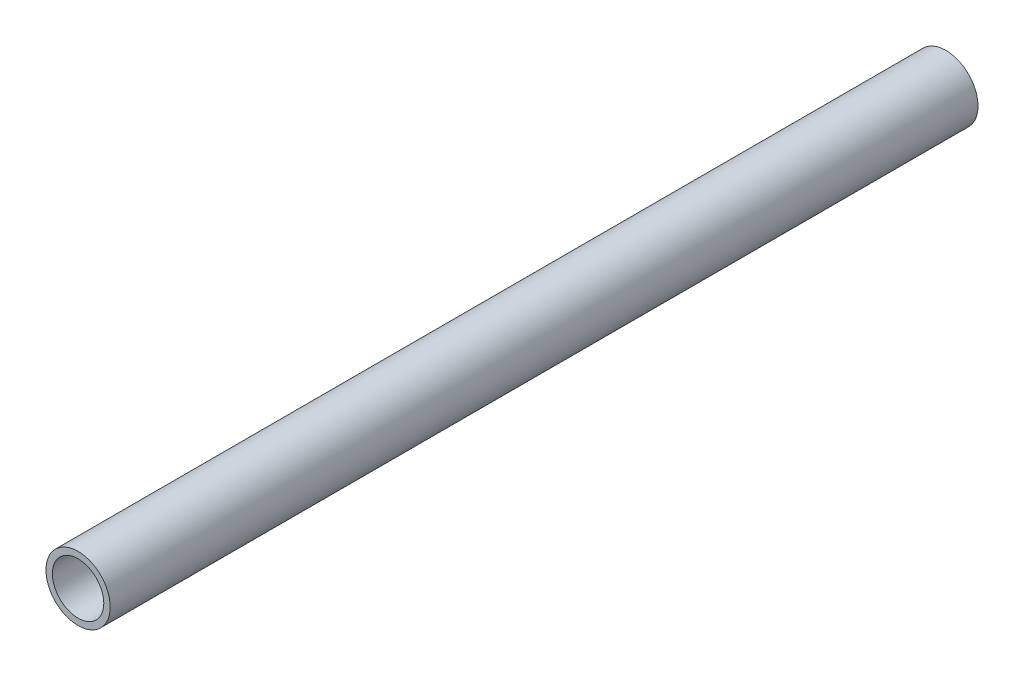
ISO-10303-21;
HEADER;
FILE_DESCRIPTION(('STEP AP214'),'2;1');
FILE_NAME('part.step','',(''),(''),'','','');
FILE_SCHEMA(('AUTOMOTIVE_DESIGN { 1 0 10303 214 1 1 1 1 }'));
ENDSEC;
DATA;
#1=APPLICATION_CONTEXT('core data for automotive mechanical design processes');
#2=APPLICATION_PROTOCOL_DEFINITION('international standard','automotive_design',2000,#1);
#3=PRODUCT_CONTEXT('',#1,'mechanical');
#4=PRODUCT('Part','Part','',(#3));
#5=PRODUCT_RELATED_PRODUCT_CATEGORY('part','',(#4));
#6=PRODUCT_DEFINITION_FORMATION('','',#4);
#7=PRODUCT_DEFINITION_CONTEXT('part definition',#1,'design');
#8=PRODUCT_DEFINITION('design','',#6,#7);
#9=PRODUCT_DEFINITION_SHAPE('','',#8);
#10=(LENGTH_UNIT() NAMED_UNIT(*) SI_UNIT(.MILLI.,.METRE.));
#11=(NAMED_UNIT(*) PLANE_ANGLE_UNIT() SI_UNIT($,.RADIAN.));
#12=(NAMED_UNIT(*) SI_UNIT($,.STERADIAN.) SOLID_ANGLE_UNIT());
#13=UNCERTAINTY_MEASURE_WITH_UNIT(LENGTH_MEASURE(1.E-05),#10,'distance_accuracy_value','');
#14=(GEOMETRIC_REPRESENTATION_CONTEXT(3) GLOBAL_UNCERTAINTY_ASSIGNED_CONTEXT((#13)) GLOBAL_UNIT_ASSIGNED_CONTEXT((#10,
#11,#12)) REPRESENTATION_CONTEXT('',''));
#15=CARTESIAN_POINT('',(0.,0.,0.));
#16=DIRECTION('',(0.,0.,1.));
#17=DIRECTION('',(1.,0.,0.));
#18=AXIS2_PLACEMENT_3D('',#15,#16,#17);
#19=CARTESIAN_POINT('',(0.,0.,270.));
#20=DIRECTION('',(0.,0.,1.));
#21=DIRECTION('',(1.,0.,0.));
#22=AXIS2_PLACEMENT_3D('',#19,#20,#21);
#23=PLANE('',#22);
#24=CARTESIAN_POINT('',(0.,0.,270.));
#25=DIRECTION('',(0.,0.,1.));
#26=DIRECTION('',(1.,0.,0.));
#27=AXIS2_PLACEMENT_3D('',#24,#25,#26);
#28=CIRCLE('',#27,10.);
#29=CARTESIAN_POINT('',(10.,0.,270.));
#30=VERTEX_POINT('',#29);
#31=EDGE_CURVE('E11',#30,#30,#28,.T.);
#32=ORIENTED_EDGE('',*,*,#31,.T.);
#33=EDGE_LOOP('',(#32));
#34=FACE_BOUND('',#33,.T.);
#35=CARTESIAN_POINT('',(0.,0.,270.));
#36=DIRECTION('',(0.,0.,1.));
#37=DIRECTION('',(1.,0.,0.));
#38=AXIS2_PLACEMENT_3D('',#35,#36,#37);
#39=CIRCLE('',#38,8.);
#40=CARTESIAN_POINT('',(8.,0.,270.));
#41=VERTEX_POINT('',#40);
#42=EDGE_CURVE('E48',#41,#41,#39,.T.);
#43=ORIENTED_EDGE('',*,*,#42,.F.);
#44=EDGE_LOOP('',(#43));
#45=FACE_BOUND('',#44,.T.);
#46=ADVANCED_FACE('F37',(#34,#45),#23,.T.);
#47=CARTESIAN_POINT('',(0.,0.,0.));
#48=DIRECTION('',(0.,0.,1.));
#49=DIRECTION('',(1.,0.,0.));
#50=AXIS2_PLACEMENT_3D('',#47,#48,#49);
#51=PLANE('',#50);
#52=CARTESIAN_POINT('',(0.,0.,0.));
#53=DIRECTION('',(0.,0.,1.));
#54=DIRECTION('',(1.,0.,0.));
#55=AXIS2_PLACEMENT_3D('',#52,#53,#54);
#56=CIRCLE('',#55,10.);
#57=CARTESIAN_POINT('',(10.,0.,0.));
#58=VERTEX_POINT('',#57);
#59=EDGE_CURVE('E41',#58,#58,#56,.T.);
#60=ORIENTED_EDGE('',*,*,#59,.F.);
#61=EDGE_LOOP('',(#60));
#62=FACE_BOUND('',#61,.T.);
#63=CARTESIAN_POINT('',(0.,0.,0.));
#64=DIRECTION('',(0.,0.,1.));
#65=DIRECTION('',(1.,0.,0.));
#66=AXIS2_PLACEMENT_3D('',#63,#64,#65);
#67=CIRCLE('',#66,8.);
#68=CARTESIAN_POINT('',(8.,0.,0.));
#69=VERTEX_POINT('',#68);
#70=EDGE_CURVE('E50',#69,#69,#67,.T.);
#71=ORIENTED_EDGE('',*,*,#70,.T.);
#72=EDGE_LOOP('',(#71));
#73=FACE_BOUND('',#72,.T.);
#74=ADVANCED_FACE('F60',(#62,#73),#51,.F.);
#75=CARTESIAN_POINT('',(0.,0.,270.));
#76=DIRECTION('',(0.,0.,-1.));
#77=DIRECTION('',(-1.,0.,0.));
#78=AXIS2_PLACEMENT_3D('',#75,#76,#77);
#79=CYLINDRICAL_SURFACE('',#78,10.);
#80=ORIENTED_EDGE('',*,*,#31,.F.);
#81=EDGE_LOOP('',(#80));
#82=FACE_BOUND('',#81,.T.);
#83=ORIENTED_EDGE('',*,*,#59,.T.);
#84=EDGE_LOOP('',(#83));
#85=FACE_BOUND('',#84,.T.);
#86=ADVANCED_FACE('F39',(#82,#85),#79,.T.);
#87=CARTESIAN_POINT('',(0.,0.,270.));
#88=DIRECTION('',(0.,0.,-1.));
#89=DIRECTION('',(-1.,0.,0.));
#90=AXIS2_PLACEMENT_3D('',#87,#88,#89);
#91=CYLINDRICAL_SURFACE('',#90,8.);
#92=ORIENTED_EDGE('',*,*,#42,.T.);
#93=EDGE_LOOP('',(#92));
#94=FACE_BOUND('',#93,.T.);
#95=ORIENTED_EDGE('',*,*,#70,.F.);
#96=EDGE_LOOP('',(#95));
#97=FACE_BOUND('',#96,.T.);
#98=ADVANCED_FACE('F56',(#94,#97),#91,.F.);
#99=CLOSED_SHELL('',(#46,#74,#86,#98));
#100=MANIFOLD_SOLID_BREP('B2',#99);
#101=ADVANCED_BREP_SHAPE_REPRESENTATION('',(#18,#100),#14);
#102=SHAPE_DEFINITION_REPRESENTATION(#9,#101);
ENDSEC;
END-ISO-10303-21;
